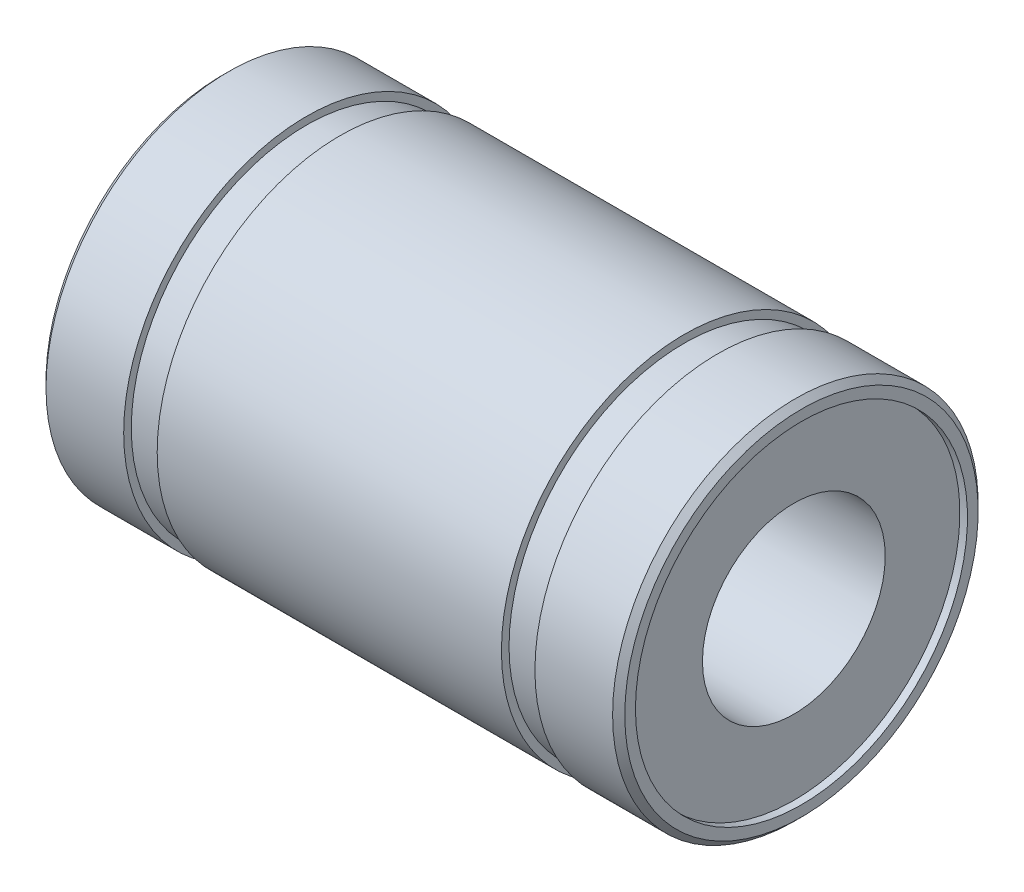
ISO-10303-21;
HEADER;
FILE_DESCRIPTION(('STEP AP214'),'2;1');
FILE_NAME('part.step','',(''),(''),'','','');
FILE_SCHEMA(('AUTOMOTIVE_DESIGN { 1 0 10303 214 1 1 1 1 }'));
ENDSEC;
DATA;
#1=APPLICATION_CONTEXT('core data for automotive mechanical design processes');
#2=APPLICATION_PROTOCOL_DEFINITION('international standard','automotive_design',2000,#1);
#3=PRODUCT_CONTEXT('',#1,'mechanical');
#4=PRODUCT('Part','Part','',(#3));
#5=PRODUCT_RELATED_PRODUCT_CATEGORY('part','',(#4));
#6=PRODUCT_DEFINITION_FORMATION('','',#4);
#7=PRODUCT_DEFINITION_CONTEXT('part definition',#1,'design');
#8=PRODUCT_DEFINITION('design','',#6,#7);
#9=PRODUCT_DEFINITION_SHAPE('','',#8);
#10=(LENGTH_UNIT() NAMED_UNIT(*) SI_UNIT(.MILLI.,.METRE.));
#11=(NAMED_UNIT(*) PLANE_ANGLE_UNIT() SI_UNIT($,.RADIAN.));
#12=(NAMED_UNIT(*) SI_UNIT($,.STERADIAN.) SOLID_ANGLE_UNIT());
#13=UNCERTAINTY_MEASURE_WITH_UNIT(LENGTH_MEASURE(1.E-05),#10,'distance_accuracy_value','');
#14=(GEOMETRIC_REPRESENTATION_CONTEXT(3) GLOBAL_UNCERTAINTY_ASSIGNED_CONTEXT((#13)) GLOBAL_UNIT_ASSIGNED_CONTEXT((#10,
#11,#12)) REPRESENTATION_CONTEXT('',''));
#15=CARTESIAN_POINT('',(0.,0.,0.));
#16=DIRECTION('',(0.,0.,1.));
#17=DIRECTION('',(1.,0.,0.));
#18=AXIS2_PLACEMENT_3D('',#15,#16,#17);
#19=CARTESIAN_POINT('',(0.,0.,0.));
#20=DIRECTION('',(-1.,0.,0.));
#21=DIRECTION('',(0.,0.,1.));
#22=AXIS2_PLACEMENT_3D('',#19,#20,#21);
#23=CYLINDRICAL_SURFACE('',#22,3.);
#24=CARTESIAN_POINT('',(18.75,0.,0.));
#25=DIRECTION('',(-1.,0.,0.));
#26=DIRECTION('',(0.,0.,1.));
#27=AXIS2_PLACEMENT_3D('',#24,#25,#26);
#28=CIRCLE('',#27,3.);
#29=CARTESIAN_POINT('',(18.75,0.,3.));
#30=VERTEX_POINT('',#29);
#31=EDGE_CURVE('E96',#30,#30,#28,.T.);
#32=ORIENTED_EDGE('',*,*,#31,.F.);
#33=EDGE_LOOP('',(#32));
#34=FACE_BOUND('',#33,.T.);
#35=CARTESIAN_POINT('',(0.25,0.,0.));
#36=DIRECTION('',(-1.,0.,0.));
#37=DIRECTION('',(0.,0.,1.));
#38=AXIS2_PLACEMENT_3D('',#35,#36,#37);
#39=CIRCLE('',#38,3.);
#40=CARTESIAN_POINT('',(0.25,0.,3.));
#41=VERTEX_POINT('',#40);
#42=EDGE_CURVE('E57',#41,#41,#39,.T.);
#43=ORIENTED_EDGE('',*,*,#42,.T.);
#44=EDGE_LOOP('',(#43));
#45=FACE_BOUND('',#44,.T.);
#46=ADVANCED_FACE('F36',(#34,#45),#23,.F.);
#47=CARTESIAN_POINT('',(0.25,3.,0.));
#48=DIRECTION('',(1.,0.,0.));
#49=DIRECTION('',(0.,0.,-1.));
#50=AXIS2_PLACEMENT_3D('',#47,#48,#49);
#51=PLANE('',#50);
#52=ORIENTED_EDGE('',*,*,#42,.F.);
#53=EDGE_LOOP('',(#52));
#54=FACE_BOUND('',#53,.T.);
#55=CARTESIAN_POINT('',(0.25,0.,0.));
#56=DIRECTION('',(-1.,0.,0.));
#57=DIRECTION('',(0.,0.,1.));
#58=AXIS2_PLACEMENT_3D('',#55,#56,#57);
#59=CIRCLE('',#58,5.45);
#60=CARTESIAN_POINT('',(0.25,0.,5.45));
#61=VERTEX_POINT('',#60);
#62=EDGE_CURVE('E60',#61,#61,#59,.T.);
#63=ORIENTED_EDGE('',*,*,#62,.T.);
#64=EDGE_LOOP('',(#63));
#65=FACE_BOUND('',#64,.T.);
#66=ADVANCED_FACE('F104',(#54,#65),#51,.F.);
#67=CARTESIAN_POINT('',(0.,0.,0.));
#68=DIRECTION('',(-1.,0.,0.));
#69=DIRECTION('',(0.,0.,1.));
#70=AXIS2_PLACEMENT_3D('',#67,#68,#69);
#71=CYLINDRICAL_SURFACE('',#70,5.45);
#72=ORIENTED_EDGE('',*,*,#62,.F.);
#73=EDGE_LOOP('',(#72));
#74=FACE_BOUND('',#73,.T.);
#75=CARTESIAN_POINT('',(0.,0.,0.));
#76=DIRECTION('',(-1.,0.,0.));
#77=DIRECTION('',(0.,0.,1.));
#78=AXIS2_PLACEMENT_3D('',#75,#76,#77);
#79=CIRCLE('',#78,5.45);
#80=CARTESIAN_POINT('',(0.,0.,5.45));
#81=VERTEX_POINT('',#80);
#82=EDGE_CURVE('E63',#81,#81,#79,.T.);
#83=ORIENTED_EDGE('',*,*,#82,.T.);
#84=EDGE_LOOP('',(#83));
#85=FACE_BOUND('',#84,.T.);
#86=ADVANCED_FACE('F110',(#74,#85),#71,.F.);
#87=CARTESIAN_POINT('',(0.,5.45,0.));
#88=DIRECTION('',(1.,0.,0.));
#89=DIRECTION('',(0.,0.,-1.));
#90=AXIS2_PLACEMENT_3D('',#87,#88,#89);
#91=PLANE('',#90);
#92=CARTESIAN_POINT('',(0.,0.,0.));
#93=DIRECTION('',(1.,0.,0.));
#94=DIRECTION('',(0.,0.,-1.));
#95=AXIS2_PLACEMENT_3D('',#92,#93,#94);
#96=CIRCLE('',#95,5.8);
#97=CARTESIAN_POINT('',(0.,0.,-5.8));
#98=VERTEX_POINT('',#97);
#99=EDGE_CURVE('E44',#98,#98,#96,.F.);
#100=ORIENTED_EDGE('',*,*,#99,.T.);
#101=EDGE_LOOP('',(#100));
#102=FACE_BOUND('',#101,.T.);
#103=ORIENTED_EDGE('',*,*,#82,.F.);
#104=EDGE_LOOP('',(#103));
#105=FACE_BOUND('',#104,.T.);
#106=ADVANCED_FACE('F116',(#102,#105),#91,.F.);
#107=CARTESIAN_POINT('',(0.,0.,0.));
#108=DIRECTION('',(-1.,0.,0.));
#109=DIRECTION('',(0.,0.,1.));
#110=AXIS2_PLACEMENT_3D('',#107,#108,#109);
#111=CYLINDRICAL_SURFACE('',#110,6.);
#112=CARTESIAN_POINT('',(0.200000000000001,0.,0.));
#113=DIRECTION('',(1.,0.,0.));
#114=DIRECTION('',(0.,0.,-1.));
#115=AXIS2_PLACEMENT_3D('',#112,#113,#114);
#116=CIRCLE('',#115,6.);
#117=CARTESIAN_POINT('',(0.200000000000001,0.,-6.));
#118=VERTEX_POINT('',#117);
#119=EDGE_CURVE('E10',#118,#118,#116,.T.);
#120=ORIENTED_EDGE('',*,*,#119,.T.);
#121=EDGE_LOOP('',(#120));
#122=FACE_BOUND('',#121,.T.);
#123=CARTESIAN_POINT('',(2.75,0.,0.));
#124=DIRECTION('',(-1.,0.,0.));
#125=DIRECTION('',(0.,0.,1.));
#126=AXIS2_PLACEMENT_3D('',#123,#124,#125);
#127=CIRCLE('',#126,6.);
#128=CARTESIAN_POINT('',(2.75,0.,6.));
#129=VERTEX_POINT('',#128);
#130=EDGE_CURVE('E66',#129,#129,#127,.T.);
#131=ORIENTED_EDGE('',*,*,#130,.T.);
#132=EDGE_LOOP('',(#131));
#133=FACE_BOUND('',#132,.T.);
#134=ADVANCED_FACE('F121',(#122,#133),#111,.T.);
#135=CARTESIAN_POINT('',(2.75,6.,0.));
#136=DIRECTION('',(-1.,0.,0.));
#137=DIRECTION('',(0.,0.,1.));
#138=AXIS2_PLACEMENT_3D('',#135,#136,#137);
#139=PLANE('',#138);
#140=ORIENTED_EDGE('',*,*,#130,.F.);
#141=EDGE_LOOP('',(#140));
#142=FACE_BOUND('',#141,.T.);
#143=CARTESIAN_POINT('',(2.75,0.,0.));
#144=DIRECTION('',(-1.,0.,0.));
#145=DIRECTION('',(0.,0.,1.));
#146=AXIS2_PLACEMENT_3D('',#143,#144,#145);
#147=CIRCLE('',#146,5.75);
#148=CARTESIAN_POINT('',(2.75,0.,5.75));
#149=VERTEX_POINT('',#148);
#150=EDGE_CURVE('E69',#149,#149,#147,.T.);
#151=ORIENTED_EDGE('',*,*,#150,.T.);
#152=EDGE_LOOP('',(#151));
#153=FACE_BOUND('',#152,.T.);
#154=ADVANCED_FACE('F126',(#142,#153),#139,.F.);
#155=CARTESIAN_POINT('',(0.,0.,0.));
#156=DIRECTION('',(-1.,0.,0.));
#157=DIRECTION('',(0.,0.,1.));
#158=AXIS2_PLACEMENT_3D('',#155,#156,#157);
#159=CYLINDRICAL_SURFACE('',#158,5.75);
#160=ORIENTED_EDGE('',*,*,#150,.F.);
#161=EDGE_LOOP('',(#160));
#162=FACE_BOUND('',#161,.T.);
#163=CARTESIAN_POINT('',(3.85,0.,0.));
#164=DIRECTION('',(-1.,0.,0.));
#165=DIRECTION('',(0.,0.,1.));
#166=AXIS2_PLACEMENT_3D('',#163,#164,#165);
#167=CIRCLE('',#166,5.75);
#168=CARTESIAN_POINT('',(3.85,0.,5.75));
#169=VERTEX_POINT('',#168);
#170=EDGE_CURVE('E72',#169,#169,#167,.T.);
#171=ORIENTED_EDGE('',*,*,#170,.T.);
#172=EDGE_LOOP('',(#171));
#173=FACE_BOUND('',#172,.T.);
#174=ADVANCED_FACE('F178',(#162,#173),#159,.T.);
#175=CARTESIAN_POINT('',(3.85,5.75,0.));
#176=DIRECTION('',(1.,0.,0.));
#177=DIRECTION('',(0.,0.,-1.));
#178=AXIS2_PLACEMENT_3D('',#175,#176,#177);
#179=PLANE('',#178);
#180=ORIENTED_EDGE('',*,*,#170,.F.);
#181=EDGE_LOOP('',(#180));
#182=FACE_BOUND('',#181,.T.);
#183=CARTESIAN_POINT('',(3.85,0.,0.));
#184=DIRECTION('',(-1.,0.,0.));
#185=DIRECTION('',(0.,0.,1.));
#186=AXIS2_PLACEMENT_3D('',#183,#184,#185);
#187=CIRCLE('',#186,6.);
#188=CARTESIAN_POINT('',(3.85,0.,6.));
#189=VERTEX_POINT('',#188);
#190=EDGE_CURVE('E75',#189,#189,#187,.T.);
#191=ORIENTED_EDGE('',*,*,#190,.T.);
#192=EDGE_LOOP('',(#191));
#193=FACE_BOUND('',#192,.T.);
#194=ADVANCED_FACE('F174',(#182,#193),#179,.F.);
#195=CARTESIAN_POINT('',(0.,0.,0.));
#196=DIRECTION('',(-1.,0.,0.));
#197=DIRECTION('',(0.,0.,1.));
#198=AXIS2_PLACEMENT_3D('',#195,#196,#197);
#199=CYLINDRICAL_SURFACE('',#198,6.);
#200=ORIENTED_EDGE('',*,*,#190,.F.);
#201=EDGE_LOOP('',(#200));
#202=FACE_BOUND('',#201,.T.);
#203=CARTESIAN_POINT('',(15.15,0.,0.));
#204=DIRECTION('',(-1.,0.,0.));
#205=DIRECTION('',(0.,0.,1.));
#206=AXIS2_PLACEMENT_3D('',#203,#204,#205);
#207=CIRCLE('',#206,6.);
#208=CARTESIAN_POINT('',(15.15,0.,6.));
#209=VERTEX_POINT('',#208);
#210=EDGE_CURVE('E78',#209,#209,#207,.T.);
#211=ORIENTED_EDGE('',*,*,#210,.T.);
#212=EDGE_LOOP('',(#211));
#213=FACE_BOUND('',#212,.T.);
#214=ADVANCED_FACE('F170',(#202,#213),#199,.T.);
#215=CARTESIAN_POINT('',(15.15,6.,0.));
#216=DIRECTION('',(-1.,0.,0.));
#217=DIRECTION('',(0.,0.,1.));
#218=AXIS2_PLACEMENT_3D('',#215,#216,#217);
#219=PLANE('',#218);
#220=ORIENTED_EDGE('',*,*,#210,.F.);
#221=EDGE_LOOP('',(#220));
#222=FACE_BOUND('',#221,.T.);
#223=CARTESIAN_POINT('',(15.15,0.,0.));
#224=DIRECTION('',(-1.,0.,0.));
#225=DIRECTION('',(0.,0.,1.));
#226=AXIS2_PLACEMENT_3D('',#223,#224,#225);
#227=CIRCLE('',#226,5.75);
#228=CARTESIAN_POINT('',(15.15,0.,5.75));
#229=VERTEX_POINT('',#228);
#230=EDGE_CURVE('E81',#229,#229,#227,.T.);
#231=ORIENTED_EDGE('',*,*,#230,.T.);
#232=EDGE_LOOP('',(#231));
#233=FACE_BOUND('',#232,.T.);
#234=ADVANCED_FACE('F162',(#222,#233),#219,.F.);
#235=CARTESIAN_POINT('',(0.,0.,0.));
#236=DIRECTION('',(-1.,0.,0.));
#237=DIRECTION('',(0.,0.,1.));
#238=AXIS2_PLACEMENT_3D('',#235,#236,#237);
#239=CYLINDRICAL_SURFACE('',#238,5.75);
#240=ORIENTED_EDGE('',*,*,#230,.F.);
#241=EDGE_LOOP('',(#240));
#242=FACE_BOUND('',#241,.T.);
#243=CARTESIAN_POINT('',(16.25,0.,0.));
#244=DIRECTION('',(-1.,0.,0.));
#245=DIRECTION('',(0.,0.,1.));
#246=AXIS2_PLACEMENT_3D('',#243,#244,#245);
#247=CIRCLE('',#246,5.75);
#248=CARTESIAN_POINT('',(16.25,0.,5.75));
#249=VERTEX_POINT('',#248);
#250=EDGE_CURVE('E84',#249,#249,#247,.T.);
#251=ORIENTED_EDGE('',*,*,#250,.T.);
#252=EDGE_LOOP('',(#251));
#253=FACE_BOUND('',#252,.T.);
#254=ADVANCED_FACE('F156',(#242,#253),#239,.T.);
#255=CARTESIAN_POINT('',(16.25,5.75,0.));
#256=DIRECTION('',(1.,0.,0.));
#257=DIRECTION('',(0.,0.,-1.));
#258=AXIS2_PLACEMENT_3D('',#255,#256,#257);
#259=PLANE('',#258);
#260=ORIENTED_EDGE('',*,*,#250,.F.);
#261=EDGE_LOOP('',(#260));
#262=FACE_BOUND('',#261,.T.);
#263=CARTESIAN_POINT('',(16.25,0.,0.));
#264=DIRECTION('',(-1.,0.,0.));
#265=DIRECTION('',(0.,0.,1.));
#266=AXIS2_PLACEMENT_3D('',#263,#264,#265);
#267=CIRCLE('',#266,6.);
#268=CARTESIAN_POINT('',(16.25,0.,6.));
#269=VERTEX_POINT('',#268);
#270=EDGE_CURVE('E87',#269,#269,#267,.T.);
#271=ORIENTED_EDGE('',*,*,#270,.T.);
#272=EDGE_LOOP('',(#271));
#273=FACE_BOUND('',#272,.T.);
#274=ADVANCED_FACE('F151',(#262,#273),#259,.F.);
#275=CARTESIAN_POINT('',(0.,0.,0.));
#276=DIRECTION('',(-1.,0.,0.));
#277=DIRECTION('',(0.,0.,1.));
#278=AXIS2_PLACEMENT_3D('',#275,#276,#277);
#279=CYLINDRICAL_SURFACE('',#278,6.);
#280=CARTESIAN_POINT('',(18.8,0.,0.));
#281=DIRECTION('',(-1.,0.,0.));
#282=DIRECTION('',(0.,0.,1.));
#283=AXIS2_PLACEMENT_3D('',#280,#281,#282);
#284=CIRCLE('',#283,6.);
#285=CARTESIAN_POINT('',(18.8,0.,6.));
#286=VERTEX_POINT('',#285);
#287=EDGE_CURVE('E52',#286,#286,#284,.T.);
#288=ORIENTED_EDGE('',*,*,#287,.T.);
#289=EDGE_LOOP('',(#288));
#290=FACE_BOUND('',#289,.T.);
#291=ORIENTED_EDGE('',*,*,#270,.F.);
#292=EDGE_LOOP('',(#291));
#293=FACE_BOUND('',#292,.T.);
#294=ADVANCED_FACE('F147',(#290,#293),#279,.T.);
#295=CARTESIAN_POINT('',(19.,6.,0.));
#296=DIRECTION('',(-1.,0.,0.));
#297=DIRECTION('',(0.,0.,1.));
#298=AXIS2_PLACEMENT_3D('',#295,#296,#297);
#299=PLANE('',#298);
#300=CARTESIAN_POINT('',(19.,0.,0.));
#301=DIRECTION('',(-1.,0.,0.));
#302=DIRECTION('',(0.,0.,1.));
#303=AXIS2_PLACEMENT_3D('',#300,#301,#302);
#304=CIRCLE('',#303,5.8);
#305=CARTESIAN_POINT('',(19.,0.,5.8));
#306=VERTEX_POINT('',#305);
#307=EDGE_CURVE('E48',#306,#306,#304,.F.);
#308=ORIENTED_EDGE('',*,*,#307,.T.);
#309=EDGE_LOOP('',(#308));
#310=FACE_BOUND('',#309,.T.);
#311=CARTESIAN_POINT('',(19.,0.,0.));
#312=DIRECTION('',(-1.,0.,0.));
#313=DIRECTION('',(0.,0.,1.));
#314=AXIS2_PLACEMENT_3D('',#311,#312,#313);
#315=CIRCLE('',#314,5.45);
#316=CARTESIAN_POINT('',(19.,0.,5.45));
#317=VERTEX_POINT('',#316);
#318=EDGE_CURVE('E90',#317,#317,#315,.T.);
#319=ORIENTED_EDGE('',*,*,#318,.T.);
#320=EDGE_LOOP('',(#319));
#321=FACE_BOUND('',#320,.T.);
#322=ADVANCED_FACE('F150',(#310,#321),#299,.F.);
#323=CARTESIAN_POINT('',(0.,0.,0.));
#324=DIRECTION('',(-1.,0.,0.));
#325=DIRECTION('',(0.,0.,1.));
#326=AXIS2_PLACEMENT_3D('',#323,#324,#325);
#327=CYLINDRICAL_SURFACE('',#326,5.45);
#328=ORIENTED_EDGE('',*,*,#318,.F.);
#329=EDGE_LOOP('',(#328));
#330=FACE_BOUND('',#329,.T.);
#331=CARTESIAN_POINT('',(18.75,0.,0.));
#332=DIRECTION('',(-1.,0.,0.));
#333=DIRECTION('',(0.,0.,1.));
#334=AXIS2_PLACEMENT_3D('',#331,#332,#333);
#335=CIRCLE('',#334,5.45);
#336=CARTESIAN_POINT('',(18.75,0.,5.45));
#337=VERTEX_POINT('',#336);
#338=EDGE_CURVE('E93',#337,#337,#335,.T.);
#339=ORIENTED_EDGE('',*,*,#338,.T.);
#340=EDGE_LOOP('',(#339));
#341=FACE_BOUND('',#340,.T.);
#342=ADVANCED_FACE('F140',(#330,#341),#327,.F.);
#343=CARTESIAN_POINT('',(18.75,5.45,0.));
#344=DIRECTION('',(-1.,0.,0.));
#345=DIRECTION('',(0.,0.,1.));
#346=AXIS2_PLACEMENT_3D('',#343,#344,#345);
#347=PLANE('',#346);
#348=ORIENTED_EDGE('',*,*,#338,.F.);
#349=EDGE_LOOP('',(#348));
#350=FACE_BOUND('',#349,.T.);
#351=ORIENTED_EDGE('',*,*,#31,.T.);
#352=EDGE_LOOP('',(#351));
#353=FACE_BOUND('',#352,.T.);
#354=ADVANCED_FACE('F100',(#350,#353),#347,.F.);
#355=CARTESIAN_POINT('',(18.8,0.,0.));
#356=DIRECTION('',(-1.,0.,0.));
#357=DIRECTION('',(0.,0.,1.));
#358=AXIS2_PLACEMENT_3D('',#355,#356,#357);
#359=CONICAL_SURFACE('',#358,6.,0.785398163397442);
#360=ORIENTED_EDGE('',*,*,#307,.F.);
#361=EDGE_LOOP('',(#360));
#362=FACE_BOUND('',#361,.T.);
#363=ORIENTED_EDGE('',*,*,#287,.F.);
#364=EDGE_LOOP('',(#363));
#365=FACE_BOUND('',#364,.T.);
#366=ADVANCED_FACE('F130',(#362,#365),#359,.T.);
#367=CARTESIAN_POINT('',(0.,0.,0.));
#368=DIRECTION('',(1.,0.,0.));
#369=DIRECTION('',(0.,0.,-1.));
#370=AXIS2_PLACEMENT_3D('',#367,#368,#369);
#371=CONICAL_SURFACE('',#370,5.8,0.785398163397446);
#372=ORIENTED_EDGE('',*,*,#119,.F.);
#373=EDGE_LOOP('',(#372));
#374=FACE_BOUND('',#373,.T.);
#375=ORIENTED_EDGE('',*,*,#99,.F.);
#376=EDGE_LOOP('',(#375));
#377=FACE_BOUND('',#376,.T.);
#378=ADVANCED_FACE('F39',(#374,#377),#371,.T.);
#379=CLOSED_SHELL('',(#46,#66,#86,#106,#134,#154,#174,#194,#214,#234,#254,#274,#294,#322,#342,
#354,#366,#378));
#380=MANIFOLD_SOLID_BREP('B2',#379);
#381=ADVANCED_BREP_SHAPE_REPRESENTATION('',(#18,#380),#14);
#382=SHAPE_DEFINITION_REPRESENTATION(#9,#381);
ENDSEC;
END-ISO-10303-21;
